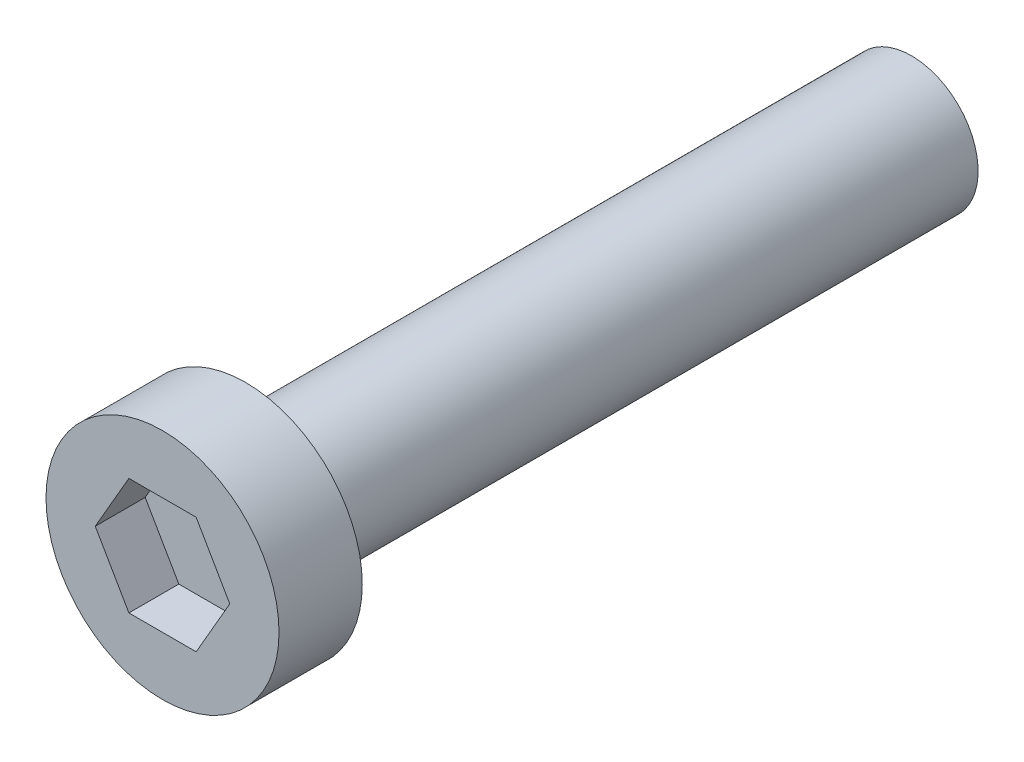
ISO-10303-21;
HEADER;
FILE_DESCRIPTION(('STEP AP214'),'2;1');
FILE_NAME('part.step','',(''),(''),'','','');
FILE_SCHEMA(('AUTOMOTIVE_DESIGN { 1 0 10303 214 1 1 1 1 }'));
ENDSEC;
DATA;
#1=APPLICATION_CONTEXT('core data for automotive mechanical design processes');
#2=APPLICATION_PROTOCOL_DEFINITION('international standard','automotive_design',2000,#1);
#3=PRODUCT_CONTEXT('',#1,'mechanical');
#4=PRODUCT('Part','Part','',(#3));
#5=PRODUCT_RELATED_PRODUCT_CATEGORY('part','',(#4));
#6=PRODUCT_DEFINITION_FORMATION('','',#4);
#7=PRODUCT_DEFINITION_CONTEXT('part definition',#1,'design');
#8=PRODUCT_DEFINITION('design','',#6,#7);
#9=PRODUCT_DEFINITION_SHAPE('','',#8);
#10=(LENGTH_UNIT() NAMED_UNIT(*) SI_UNIT(.MILLI.,.METRE.));
#11=(NAMED_UNIT(*) PLANE_ANGLE_UNIT() SI_UNIT($,.RADIAN.));
#12=(NAMED_UNIT(*) SI_UNIT($,.STERADIAN.) SOLID_ANGLE_UNIT());
#13=UNCERTAINTY_MEASURE_WITH_UNIT(LENGTH_MEASURE(1.E-05),#10,'distance_accuracy_value','');
#14=(GEOMETRIC_REPRESENTATION_CONTEXT(3) GLOBAL_UNCERTAINTY_ASSIGNED_CONTEXT((#13)) GLOBAL_UNIT_ASSIGNED_CONTEXT((#10,
#11,#12)) REPRESENTATION_CONTEXT('',''));
#15=CARTESIAN_POINT('',(0.,0.,0.));
#16=DIRECTION('',(0.,0.,1.));
#17=DIRECTION('',(1.,0.,0.));
#18=AXIS2_PLACEMENT_3D('',#15,#16,#17);
#19=CARTESIAN_POINT('',(1.01036297108185,-1.75,2.5));
#20=DIRECTION('',(-0.866025403784439,0.5,0.));
#21=DIRECTION('',(-0.5,-0.866025403784439,0.));
#22=AXIS2_PLACEMENT_3D('',#19,#20,#21);
#23=PLANE('',#22);
#24=DIRECTION('',(0.,0.,-1.));
#25=VECTOR('',#24,1.);
#26=CARTESIAN_POINT('',(2.02072594216369,0.,2.5));
#27=LINE('',#26,#25);
#28=CARTESIAN_POINT('',(2.02072594216369,0.,2.5));
#29=VERTEX_POINT('',#28);
#30=CARTESIAN_POINT('',(2.02072594216369,0.,1.));
#31=VERTEX_POINT('',#30);
#32=EDGE_CURVE('E114',#29,#31,#27,.T.);
#33=ORIENTED_EDGE('',*,*,#32,.T.);
#34=DIRECTION('',(-0.5,-0.866025403784439,0.));
#35=VECTOR('',#34,1.);
#36=CARTESIAN_POINT('',(1.51554445662277,-0.875,1.));
#37=LINE('',#36,#35);
#38=CARTESIAN_POINT('',(1.01036297108185,-1.75,1.));
#39=VERTEX_POINT('',#38);
#40=EDGE_CURVE('E268',#31,#39,#37,.T.);
#41=ORIENTED_EDGE('',*,*,#40,.T.);
#42=DIRECTION('',(0.,0.,-1.));
#43=VECTOR('',#42,1.);
#44=CARTESIAN_POINT('',(1.01036297108185,-1.75,2.5));
#45=LINE('',#44,#43);
#46=CARTESIAN_POINT('',(1.01036297108185,-1.75,2.5));
#47=VERTEX_POINT('',#46);
#48=EDGE_CURVE('E258',#47,#39,#45,.T.);
#49=ORIENTED_EDGE('',*,*,#48,.F.);
#50=DIRECTION('',(0.5,0.866025403784439,0.));
#51=VECTOR('',#50,1.);
#52=CARTESIAN_POINT('',(1.01036297108185,-1.75,2.5));
#53=LINE('',#52,#51);
#54=EDGE_CURVE('E242',#47,#29,#53,.T.);
#55=ORIENTED_EDGE('',*,*,#54,.T.);
#56=EDGE_LOOP('',(#33,#41,#49,#55));
#57=FACE_BOUND('',#56,.T.);
#58=ADVANCED_FACE('F36',(#57),#23,.T.);
#59=CARTESIAN_POINT('',(2.02072594216369,0.,2.5));
#60=DIRECTION('',(-0.866025403784438,-0.5,0.));
#61=DIRECTION('',(0.5,-0.866025403784438,0.));
#62=AXIS2_PLACEMENT_3D('',#59,#60,#61);
#63=PLANE('',#62);
#64=DIRECTION('',(0.,0.,-1.));
#65=VECTOR('',#64,1.);
#66=CARTESIAN_POINT('',(1.01036297108184,1.75,2.5));
#67=LINE('',#66,#65);
#68=CARTESIAN_POINT('',(1.01036297108184,1.75,2.5));
#69=VERTEX_POINT('',#68);
#70=CARTESIAN_POINT('',(1.01036297108184,1.75,1.));
#71=VERTEX_POINT('',#70);
#72=EDGE_CURVE('E112',#69,#71,#67,.T.);
#73=ORIENTED_EDGE('',*,*,#72,.T.);
#74=DIRECTION('',(0.5,-0.866025403784439,0.));
#75=VECTOR('',#74,1.);
#76=CARTESIAN_POINT('',(1.51554445662277,0.875000000000001,1.));
#77=LINE('',#76,#75);
#78=EDGE_CURVE('E94',#71,#31,#77,.T.);
#79=ORIENTED_EDGE('',*,*,#78,.T.);
#80=ORIENTED_EDGE('',*,*,#32,.F.);
#81=DIRECTION('',(-0.5,0.866025403784439,0.));
#82=VECTOR('',#81,1.);
#83=CARTESIAN_POINT('',(2.02072594216369,0.,2.5));
#84=LINE('',#83,#82);
#85=EDGE_CURVE('E244',#29,#69,#84,.T.);
#86=ORIENTED_EDGE('',*,*,#85,.T.);
#87=EDGE_LOOP('',(#73,#79,#80,#86));
#88=FACE_BOUND('',#87,.T.);
#89=ADVANCED_FACE('F141',(#88),#63,.T.);
#90=CARTESIAN_POINT('',(1.01036297108184,1.75,2.5));
#91=DIRECTION('',(0.,-1.,0.));
#92=DIRECTION('',(1.,0.,0.));
#93=AXIS2_PLACEMENT_3D('',#90,#91,#92);
#94=PLANE('',#93);
#95=DIRECTION('',(0.,0.,-1.));
#96=VECTOR('',#95,1.);
#97=CARTESIAN_POINT('',(-1.01036297108185,1.75,2.5));
#98=LINE('',#97,#96);
#99=CARTESIAN_POINT('',(-1.01036297108185,1.75,2.5));
#100=VERTEX_POINT('',#99);
#101=CARTESIAN_POINT('',(-1.01036297108185,1.75,1.));
#102=VERTEX_POINT('',#101);
#103=EDGE_CURVE('E104',#100,#102,#98,.T.);
#104=ORIENTED_EDGE('',*,*,#103,.T.);
#105=DIRECTION('',(1.,0.,0.));
#106=VECTOR('',#105,1.);
#107=CARTESIAN_POINT('',(0.,1.75,1.));
#108=LINE('',#107,#106);
#109=EDGE_CURVE('E89',#102,#71,#108,.T.);
#110=ORIENTED_EDGE('',*,*,#109,.T.);
#111=ORIENTED_EDGE('',*,*,#72,.F.);
#112=DIRECTION('',(-1.,0.,0.));
#113=VECTOR('',#112,1.);
#114=CARTESIAN_POINT('',(1.01036297108184,1.75,2.5));
#115=LINE('',#114,#113);
#116=EDGE_CURVE('E111',#69,#100,#115,.T.);
#117=ORIENTED_EDGE('',*,*,#116,.T.);
#118=EDGE_LOOP('',(#104,#110,#111,#117));
#119=FACE_BOUND('',#118,.T.);
#120=ADVANCED_FACE('F109',(#119),#94,.T.);
#121=CARTESIAN_POINT('',(-1.01036297108185,1.75,2.5));
#122=DIRECTION('',(0.866025403784439,-0.5,0.));
#123=DIRECTION('',(0.5,0.866025403784439,0.));
#124=AXIS2_PLACEMENT_3D('',#121,#122,#123);
#125=PLANE('',#124);
#126=DIRECTION('',(0.,0.,-1.));
#127=VECTOR('',#126,1.);
#128=CARTESIAN_POINT('',(-2.02072594216369,0.,2.5));
#129=LINE('',#128,#127);
#130=CARTESIAN_POINT('',(-2.02072594216369,0.,2.5));
#131=VERTEX_POINT('',#130);
#132=CARTESIAN_POINT('',(-2.02072594216369,0.,1.));
#133=VERTEX_POINT('',#132);
#134=EDGE_CURVE('E107',#131,#133,#129,.T.);
#135=ORIENTED_EDGE('',*,*,#134,.T.);
#136=DIRECTION('',(0.5,0.866025403784439,0.));
#137=VECTOR('',#136,1.);
#138=CARTESIAN_POINT('',(-1.51554445662277,0.875000000000001,1.));
#139=LINE('',#138,#137);
#140=EDGE_CURVE('E92',#133,#102,#139,.T.);
#141=ORIENTED_EDGE('',*,*,#140,.T.);
#142=ORIENTED_EDGE('',*,*,#103,.F.);
#143=DIRECTION('',(-0.5,-0.866025403784439,0.));
#144=VECTOR('',#143,1.);
#145=CARTESIAN_POINT('',(-1.01036297108185,1.75,2.5));
#146=LINE('',#145,#144);
#147=EDGE_CURVE('E252',#100,#131,#146,.T.);
#148=ORIENTED_EDGE('',*,*,#147,.T.);
#149=EDGE_LOOP('',(#135,#141,#142,#148));
#150=FACE_BOUND('',#149,.T.);
#151=ADVANCED_FACE('F103',(#150),#125,.T.);
#152=CARTESIAN_POINT('',(-2.02072594216369,0.,2.5));
#153=DIRECTION('',(0.866025403784438,0.5,0.));
#154=DIRECTION('',(-0.5,0.866025403784438,0.));
#155=AXIS2_PLACEMENT_3D('',#152,#153,#154);
#156=PLANE('',#155);
#157=DIRECTION('',(0.,0.,-1.));
#158=VECTOR('',#157,1.);
#159=CARTESIAN_POINT('',(-1.01036297108184,-1.75,2.5));
#160=LINE('',#159,#158);
#161=CARTESIAN_POINT('',(-1.01036297108184,-1.75,2.5));
#162=VERTEX_POINT('',#161);
#163=CARTESIAN_POINT('',(-1.01036297108184,-1.75,1.));
#164=VERTEX_POINT('',#163);
#165=EDGE_CURVE('E60',#162,#164,#160,.T.);
#166=ORIENTED_EDGE('',*,*,#165,.T.);
#167=DIRECTION('',(-0.5,0.866025403784439,0.));
#168=VECTOR('',#167,1.);
#169=CARTESIAN_POINT('',(-1.51554445662277,-0.875,1.));
#170=LINE('',#169,#168);
#171=EDGE_CURVE('E53',#164,#133,#170,.T.);
#172=ORIENTED_EDGE('',*,*,#171,.T.);
#173=ORIENTED_EDGE('',*,*,#134,.F.);
#174=DIRECTION('',(0.5,-0.866025403784439,0.));
#175=VECTOR('',#174,1.);
#176=CARTESIAN_POINT('',(-2.02072594216369,0.,2.5));
#177=LINE('',#176,#175);
#178=EDGE_CURVE('E254',#131,#162,#177,.T.);
#179=ORIENTED_EDGE('',*,*,#178,.T.);
#180=EDGE_LOOP('',(#166,#172,#173,#179));
#181=FACE_BOUND('',#180,.T.);
#182=ADVANCED_FACE('F154',(#181),#156,.T.);
#183=CARTESIAN_POINT('',(-1.01036297108184,-1.75,2.5));
#184=DIRECTION('',(0.,1.,0.));
#185=DIRECTION('',(-1.,0.,0.));
#186=AXIS2_PLACEMENT_3D('',#183,#184,#185);
#187=PLANE('',#186);
#188=ORIENTED_EDGE('',*,*,#48,.T.);
#189=DIRECTION('',(-1.,0.,0.));
#190=VECTOR('',#189,1.);
#191=CARTESIAN_POINT('',(0.,-1.75,1.));
#192=LINE('',#191,#190);
#193=EDGE_CURVE('E246',#39,#164,#192,.T.);
#194=ORIENTED_EDGE('',*,*,#193,.T.);
#195=ORIENTED_EDGE('',*,*,#165,.F.);
#196=DIRECTION('',(1.,0.,0.));
#197=VECTOR('',#196,1.);
#198=CARTESIAN_POINT('',(-1.01036297108184,-1.75,2.5));
#199=LINE('',#198,#197);
#200=EDGE_CURVE('E256',#162,#47,#199,.T.);
#201=ORIENTED_EDGE('',*,*,#200,.T.);
#202=EDGE_LOOP('',(#188,#194,#195,#201));
#203=FACE_BOUND('',#202,.T.);
#204=ADVANCED_FACE('F137',(#203),#187,.T.);
#205=CARTESIAN_POINT('',(0.,0.,2.5));
#206=DIRECTION('',(0.,0.,1.));
#207=DIRECTION('',(1.,0.,0.));
#208=AXIS2_PLACEMENT_3D('',#205,#206,#207);
#209=PLANE('',#208);
#210=CARTESIAN_POINT('',(0.,0.,2.5));
#211=DIRECTION('',(0.,0.,1.));
#212=DIRECTION('',(1.,0.,0.));
#213=AXIS2_PLACEMENT_3D('',#210,#211,#212);
#214=CIRCLE('',#213,3.5);
#215=CARTESIAN_POINT('',(3.5,0.,2.5));
#216=VERTEX_POINT('',#215);
#217=EDGE_CURVE('E45',#216,#216,#214,.T.);
#218=ORIENTED_EDGE('',*,*,#217,.T.);
#219=EDGE_LOOP('',(#218));
#220=FACE_BOUND('',#219,.T.);
#221=ORIENTED_EDGE('',*,*,#85,.F.);
#222=ORIENTED_EDGE('',*,*,#54,.F.);
#223=ORIENTED_EDGE('',*,*,#200,.F.);
#224=ORIENTED_EDGE('',*,*,#178,.F.);
#225=ORIENTED_EDGE('',*,*,#147,.F.);
#226=ORIENTED_EDGE('',*,*,#116,.F.);
#227=EDGE_LOOP('',(#221,#222,#223,#224,#225,#226));
#228=FACE_BOUND('',#227,.T.);
#229=ADVANCED_FACE('F129',(#220,#228),#209,.T.);
#230=CARTESIAN_POINT('',(0.,0.,0.));
#231=DIRECTION('',(0.,0.,1.));
#232=DIRECTION('',(1.,0.,0.));
#233=AXIS2_PLACEMENT_3D('',#230,#231,#232);
#234=PLANE('',#233);
#235=CARTESIAN_POINT('',(0.,0.,0.));
#236=DIRECTION('',(0.,0.,-1.));
#237=DIRECTION('',(-1.,0.,0.));
#238=AXIS2_PLACEMENT_3D('',#235,#236,#237);
#239=CIRCLE('',#238,2.);
#240=CARTESIAN_POINT('',(-2.,0.,0.));
#241=VERTEX_POINT('',#240);
#242=EDGE_CURVE('E11',#241,#241,#239,.T.);
#243=ORIENTED_EDGE('',*,*,#242,.F.);
#244=EDGE_LOOP('',(#243));
#245=FACE_BOUND('',#244,.T.);
#246=CARTESIAN_POINT('',(0.,0.,0.));
#247=DIRECTION('',(0.,0.,1.));
#248=DIRECTION('',(1.,0.,0.));
#249=AXIS2_PLACEMENT_3D('',#246,#247,#248);
#250=CIRCLE('',#249,3.5);
#251=CARTESIAN_POINT('',(3.5,0.,0.));
#252=VERTEX_POINT('',#251);
#253=EDGE_CURVE('E40',#252,#252,#250,.T.);
#254=ORIENTED_EDGE('',*,*,#253,.F.);
#255=EDGE_LOOP('',(#254));
#256=FACE_BOUND('',#255,.T.);
#257=ADVANCED_FACE('F127',(#245,#256),#234,.F.);
#258=CARTESIAN_POINT('',(0.,0.,2.5));
#259=DIRECTION('',(0.,0.,-1.));
#260=DIRECTION('',(-1.,0.,0.));
#261=AXIS2_PLACEMENT_3D('',#258,#259,#260);
#262=CYLINDRICAL_SURFACE('',#261,3.5);
#263=ORIENTED_EDGE('',*,*,#217,.F.);
#264=EDGE_LOOP('',(#263));
#265=FACE_BOUND('',#264,.T.);
#266=ORIENTED_EDGE('',*,*,#253,.T.);
#267=EDGE_LOOP('',(#266));
#268=FACE_BOUND('',#267,.T.);
#269=ADVANCED_FACE('F38',(#265,#268),#262,.T.);
#270=CARTESIAN_POINT('',(0.,0.,-20.));
#271=DIRECTION('',(0.,0.,1.));
#272=DIRECTION('',(1.,0.,0.));
#273=AXIS2_PLACEMENT_3D('',#270,#271,#272);
#274=CYLINDRICAL_SURFACE('',#273,2.);
#275=CARTESIAN_POINT('',(0.,0.,-20.));
#276=DIRECTION('',(0.,0.,-1.));
#277=DIRECTION('',(-1.,0.,0.));
#278=AXIS2_PLACEMENT_3D('',#275,#276,#277);
#279=CIRCLE('',#278,2.);
#280=CARTESIAN_POINT('',(-2.,0.,-20.));
#281=VERTEX_POINT('',#280);
#282=EDGE_CURVE('E241',#281,#281,#279,.T.);
#283=ORIENTED_EDGE('',*,*,#282,.F.);
#284=EDGE_LOOP('',(#283));
#285=FACE_BOUND('',#284,.T.);
#286=ORIENTED_EDGE('',*,*,#242,.T.);
#287=EDGE_LOOP('',(#286));
#288=FACE_BOUND('',#287,.T.);
#289=ADVANCED_FACE('F135',(#285,#288),#274,.T.);
#290=CARTESIAN_POINT('',(0.,0.,-20.));
#291=DIRECTION('',(0.,0.,-1.));
#292=DIRECTION('',(-1.,0.,0.));
#293=AXIS2_PLACEMENT_3D('',#290,#291,#292);
#294=PLANE('',#293);
#295=ORIENTED_EDGE('',*,*,#282,.T.);
#296=EDGE_LOOP('',(#295));
#297=FACE_BOUND('',#296,.T.);
#298=ADVANCED_FACE('F162',(#297),#294,.T.);
#299=CARTESIAN_POINT('',(0.,0.,1.));
#300=DIRECTION('',(0.,0.,-1.));
#301=DIRECTION('',(-1.,0.,0.));
#302=AXIS2_PLACEMENT_3D('',#299,#300,#301);
#303=PLANE('',#302);
#304=ORIENTED_EDGE('',*,*,#140,.F.);
#305=ORIENTED_EDGE('',*,*,#171,.F.);
#306=ORIENTED_EDGE('',*,*,#193,.F.);
#307=ORIENTED_EDGE('',*,*,#40,.F.);
#308=ORIENTED_EDGE('',*,*,#78,.F.);
#309=ORIENTED_EDGE('',*,*,#109,.F.);
#310=EDGE_LOOP('',(#304,#305,#306,#307,#308,#309));
#311=FACE_BOUND('',#310,.T.);
#312=ADVANCED_FACE('F91',(#311),#303,.F.);
#313=CLOSED_SHELL('',(#58,#89,#120,#151,#182,#204,#229,#257,#269,#289,#298,#312));
#314=MANIFOLD_SOLID_BREP('B2',#313);
#315=ADVANCED_BREP_SHAPE_REPRESENTATION('',(#18,#314),#14);
#316=SHAPE_DEFINITION_REPRESENTATION(#9,#315);
ENDSEC;
END-ISO-10303-21;
